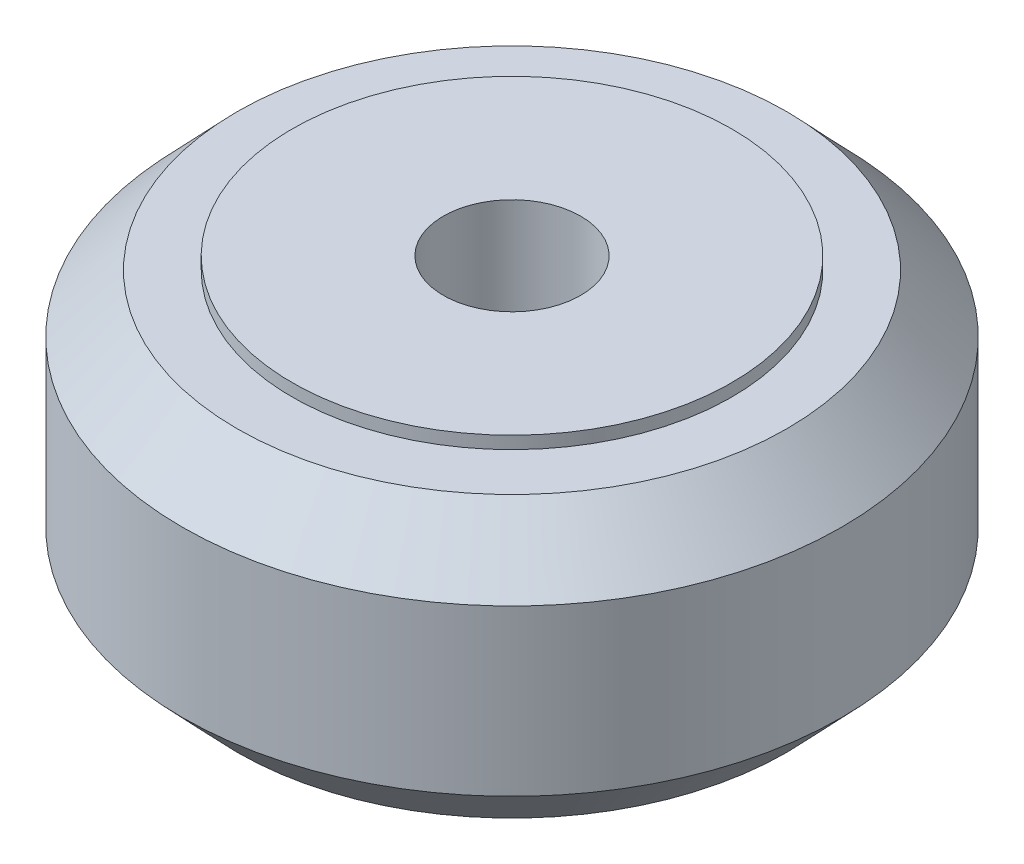
ISO-10303-21;
HEADER;
FILE_DESCRIPTION(('STEP AP214'),'2;1');
FILE_NAME('part.step','',(''),(''),'','','');
FILE_SCHEMA(('AUTOMOTIVE_DESIGN { 1 0 10303 214 1 1 1 1 }'));
ENDSEC;
DATA;
#1=APPLICATION_CONTEXT('core data for automotive mechanical design processes');
#2=APPLICATION_PROTOCOL_DEFINITION('international standard','automotive_design',2000,#1);
#3=PRODUCT_CONTEXT('',#1,'mechanical');
#4=PRODUCT('Part','Part','',(#3));
#5=PRODUCT_RELATED_PRODUCT_CATEGORY('part','',(#4));
#6=PRODUCT_DEFINITION_FORMATION('','',#4);
#7=PRODUCT_DEFINITION_CONTEXT('part definition',#1,'design');
#8=PRODUCT_DEFINITION('design','',#6,#7);
#9=PRODUCT_DEFINITION_SHAPE('','',#8);
#10=(LENGTH_UNIT() NAMED_UNIT(*) SI_UNIT(.MILLI.,.METRE.));
#11=(NAMED_UNIT(*) PLANE_ANGLE_UNIT() SI_UNIT($,.RADIAN.));
#12=(NAMED_UNIT(*) SI_UNIT($,.STERADIAN.) SOLID_ANGLE_UNIT());
#13=UNCERTAINTY_MEASURE_WITH_UNIT(LENGTH_MEASURE(1.E-05),#10,'distance_accuracy_value','');
#14=(GEOMETRIC_REPRESENTATION_CONTEXT(3) GLOBAL_UNCERTAINTY_ASSIGNED_CONTEXT((#13)) GLOBAL_UNIT_ASSIGNED_CONTEXT((#10,
#11,#12)) REPRESENTATION_CONTEXT('',''));
#15=CARTESIAN_POINT('',(0.,0.,0.));
#16=DIRECTION('',(0.,0.,1.));
#17=DIRECTION('',(1.,0.,0.));
#18=AXIS2_PLACEMENT_3D('',#15,#16,#17);
#19=CARTESIAN_POINT('',(2.5,-5.555,0.));
#20=DIRECTION('',(0.,-1.,0.));
#21=DIRECTION('',(0.,0.,-1.));
#22=AXIS2_PLACEMENT_3D('',#19,#20,#21);
#23=PLANE('',#22);
#24=CARTESIAN_POINT('',(0.,-5.555,0.));
#25=DIRECTION('',(0.,-1.,0.));
#26=DIRECTION('',(0.,0.,-1.));
#27=AXIS2_PLACEMENT_3D('',#24,#25,#26);
#28=CIRCLE('',#27,8.);
#29=CARTESIAN_POINT('',(0.,-5.555,-8.));
#30=VERTEX_POINT('',#29);
#31=EDGE_CURVE('E10',#30,#30,#28,.T.);
#32=ORIENTED_EDGE('',*,*,#31,.T.);
#33=EDGE_LOOP('',(#32));
#34=FACE_BOUND('',#33,.T.);
#35=CARTESIAN_POINT('',(0.,-5.555,0.));
#36=DIRECTION('',(0.,-1.,0.));
#37=DIRECTION('',(0.,0.,-1.));
#38=AXIS2_PLACEMENT_3D('',#35,#36,#37);
#39=CIRCLE('',#38,2.5);
#40=CARTESIAN_POINT('',(0.,-5.555,-2.5));
#41=VERTEX_POINT('',#40);
#42=EDGE_CURVE('E80',#41,#41,#39,.T.);
#43=ORIENTED_EDGE('',*,*,#42,.F.);
#44=EDGE_LOOP('',(#43));
#45=FACE_BOUND('',#44,.T.);
#46=ADVANCED_FACE('F36',(#34,#45),#23,.T.);
#47=CARTESIAN_POINT('',(0.,-55.,0.));
#48=DIRECTION('',(0.,-1.,0.));
#49=DIRECTION('',(0.,0.,-1.));
#50=AXIS2_PLACEMENT_3D('',#47,#48,#49);
#51=CYLINDRICAL_SURFACE('',#50,8.);
#52=CARTESIAN_POINT('',(0.,-5.1,0.));
#53=DIRECTION('',(0.,-1.,0.));
#54=DIRECTION('',(0.,0.,-1.));
#55=AXIS2_PLACEMENT_3D('',#52,#53,#54);
#56=CIRCLE('',#55,8.);
#57=CARTESIAN_POINT('',(0.,-5.1,-8.));
#58=VERTEX_POINT('',#57);
#59=EDGE_CURVE('E43',#58,#58,#56,.T.);
#60=ORIENTED_EDGE('',*,*,#59,.T.);
#61=EDGE_LOOP('',(#60));
#62=FACE_BOUND('',#61,.T.);
#63=ORIENTED_EDGE('',*,*,#31,.F.);
#64=EDGE_LOOP('',(#63));
#65=FACE_BOUND('',#64,.T.);
#66=ADVANCED_FACE('F88',(#62,#65),#51,.T.);
#67=CARTESIAN_POINT('',(8.,-5.1,0.));
#68=DIRECTION('',(0.,-1.,0.));
#69=DIRECTION('',(0.,0.,-1.));
#70=AXIS2_PLACEMENT_3D('',#67,#68,#69);
#71=PLANE('',#70);
#72=CARTESIAN_POINT('',(0.,-5.1,0.));
#73=DIRECTION('',(0.,-1.,0.));
#74=DIRECTION('',(0.,0.,-1.));
#75=AXIS2_PLACEMENT_3D('',#72,#73,#74);
#76=CIRCLE('',#75,10.);
#77=CARTESIAN_POINT('',(0.,-5.1,-10.));
#78=VERTEX_POINT('',#77);
#79=EDGE_CURVE('E49',#78,#78,#76,.T.);
#80=ORIENTED_EDGE('',*,*,#79,.T.);
#81=EDGE_LOOP('',(#80));
#82=FACE_BOUND('',#81,.T.);
#83=ORIENTED_EDGE('',*,*,#59,.F.);
#84=EDGE_LOOP('',(#83));
#85=FACE_BOUND('',#84,.T.);
#86=ADVANCED_FACE('F92',(#82,#85),#71,.T.);
#87=CARTESIAN_POINT('',(0.,-5.1,0.));
#88=DIRECTION('',(0.,1.,0.));
#89=DIRECTION('',(0.,0.,1.));
#90=AXIS2_PLACEMENT_3D('',#87,#88,#89);
#91=CONICAL_SURFACE('',#90,10.,0.76101275422473);
#92=CARTESIAN_POINT('',(0.,-3.,0.));
#93=DIRECTION('',(0.,-1.,0.));
#94=DIRECTION('',(0.,0.,-1.));
#95=AXIS2_PLACEMENT_3D('',#92,#93,#94);
#96=CIRCLE('',#95,12.);
#97=CARTESIAN_POINT('',(0.,-3.,-12.));
#98=VERTEX_POINT('',#97);
#99=EDGE_CURVE('E54',#98,#98,#96,.T.);
#100=ORIENTED_EDGE('',*,*,#99,.T.);
#101=EDGE_LOOP('',(#100));
#102=FACE_BOUND('',#101,.T.);
#103=ORIENTED_EDGE('',*,*,#79,.F.);
#104=EDGE_LOOP('',(#103));
#105=FACE_BOUND('',#104,.T.);
#106=ADVANCED_FACE('F96',(#102,#105),#91,.T.);
#107=CARTESIAN_POINT('',(0.,-55.,0.));
#108=DIRECTION('',(0.,-1.,0.));
#109=DIRECTION('',(0.,0.,-1.));
#110=AXIS2_PLACEMENT_3D('',#107,#108,#109);
#111=CYLINDRICAL_SURFACE('',#110,12.);
#112=CARTESIAN_POINT('',(0.,3.,0.));
#113=DIRECTION('',(0.,-1.,0.));
#114=DIRECTION('',(0.,0.,-1.));
#115=AXIS2_PLACEMENT_3D('',#112,#113,#114);
#116=CIRCLE('',#115,12.);
#117=CARTESIAN_POINT('',(0.,3.,-12.));
#118=VERTEX_POINT('',#117);
#119=EDGE_CURVE('E60',#118,#118,#116,.T.);
#120=ORIENTED_EDGE('',*,*,#119,.T.);
#121=EDGE_LOOP('',(#120));
#122=FACE_BOUND('',#121,.T.);
#123=ORIENTED_EDGE('',*,*,#99,.F.);
#124=EDGE_LOOP('',(#123));
#125=FACE_BOUND('',#124,.T.);
#126=ADVANCED_FACE('F103',(#122,#125),#111,.T.);
#127=CARTESIAN_POINT('',(0.,3.,0.));
#128=DIRECTION('',(0.,-1.,0.));
#129=DIRECTION('',(0.,0.,-1.));
#130=AXIS2_PLACEMENT_3D('',#127,#128,#129);
#131=CONICAL_SURFACE('',#130,12.,0.76101275422473);
#132=CARTESIAN_POINT('',(0.,5.1,0.));
#133=DIRECTION('',(0.,-1.,0.));
#134=DIRECTION('',(0.,0.,-1.));
#135=AXIS2_PLACEMENT_3D('',#132,#133,#134);
#136=CIRCLE('',#135,10.);
#137=CARTESIAN_POINT('',(0.,5.1,-10.));
#138=VERTEX_POINT('',#137);
#139=EDGE_CURVE('E64',#138,#138,#136,.T.);
#140=ORIENTED_EDGE('',*,*,#139,.T.);
#141=EDGE_LOOP('',(#140));
#142=FACE_BOUND('',#141,.T.);
#143=ORIENTED_EDGE('',*,*,#119,.F.);
#144=EDGE_LOOP('',(#143));
#145=FACE_BOUND('',#144,.T.);
#146=ADVANCED_FACE('F107',(#142,#145),#131,.T.);
#147=CARTESIAN_POINT('',(8.,5.1,0.));
#148=DIRECTION('',(0.,1.,0.));
#149=DIRECTION('',(0.,0.,1.));
#150=AXIS2_PLACEMENT_3D('',#147,#148,#149);
#151=PLANE('',#150);
#152=CARTESIAN_POINT('',(0.,5.1,0.));
#153=DIRECTION('',(0.,-1.,0.));
#154=DIRECTION('',(0.,0.,-1.));
#155=AXIS2_PLACEMENT_3D('',#152,#153,#154);
#156=CIRCLE('',#155,8.);
#157=CARTESIAN_POINT('',(0.,5.1,-8.));
#158=VERTEX_POINT('',#157);
#159=EDGE_CURVE('E68',#158,#158,#156,.T.);
#160=ORIENTED_EDGE('',*,*,#159,.T.);
#161=EDGE_LOOP('',(#160));
#162=FACE_BOUND('',#161,.T.);
#163=ORIENTED_EDGE('',*,*,#139,.F.);
#164=EDGE_LOOP('',(#163));
#165=FACE_BOUND('',#164,.T.);
#166=ADVANCED_FACE('F111',(#162,#165),#151,.T.);
#167=CARTESIAN_POINT('',(0.,-55.,0.));
#168=DIRECTION('',(0.,-1.,0.));
#169=DIRECTION('',(0.,0.,-1.));
#170=AXIS2_PLACEMENT_3D('',#167,#168,#169);
#171=CYLINDRICAL_SURFACE('',#170,8.);
#172=CARTESIAN_POINT('',(0.,5.555,0.));
#173=DIRECTION('',(0.,-1.,0.));
#174=DIRECTION('',(0.,0.,-1.));
#175=AXIS2_PLACEMENT_3D('',#172,#173,#174);
#176=CIRCLE('',#175,8.);
#177=CARTESIAN_POINT('',(0.,5.555,-8.));
#178=VERTEX_POINT('',#177);
#179=EDGE_CURVE('E72',#178,#178,#176,.T.);
#180=ORIENTED_EDGE('',*,*,#179,.T.);
#181=EDGE_LOOP('',(#180));
#182=FACE_BOUND('',#181,.T.);
#183=ORIENTED_EDGE('',*,*,#159,.F.);
#184=EDGE_LOOP('',(#183));
#185=FACE_BOUND('',#184,.T.);
#186=ADVANCED_FACE('F115',(#182,#185),#171,.T.);
#187=CARTESIAN_POINT('',(2.5,5.555,0.));
#188=DIRECTION('',(0.,1.,0.));
#189=DIRECTION('',(0.,0.,1.));
#190=AXIS2_PLACEMENT_3D('',#187,#188,#189);
#191=PLANE('',#190);
#192=CARTESIAN_POINT('',(0.,5.555,0.));
#193=DIRECTION('',(0.,-1.,0.));
#194=DIRECTION('',(0.,0.,-1.));
#195=AXIS2_PLACEMENT_3D('',#192,#193,#194);
#196=CIRCLE('',#195,2.5);
#197=CARTESIAN_POINT('',(0.,5.555,-2.5));
#198=VERTEX_POINT('',#197);
#199=EDGE_CURVE('E76',#198,#198,#196,.T.);
#200=ORIENTED_EDGE('',*,*,#199,.T.);
#201=EDGE_LOOP('',(#200));
#202=FACE_BOUND('',#201,.T.);
#203=ORIENTED_EDGE('',*,*,#179,.F.);
#204=EDGE_LOOP('',(#203));
#205=FACE_BOUND('',#204,.T.);
#206=ADVANCED_FACE('F119',(#202,#205),#191,.T.);
#207=CARTESIAN_POINT('',(0.,-55.,0.));
#208=DIRECTION('',(0.,-1.,0.));
#209=DIRECTION('',(0.,0.,-1.));
#210=AXIS2_PLACEMENT_3D('',#207,#208,#209);
#211=CYLINDRICAL_SURFACE('',#210,2.5);
#212=ORIENTED_EDGE('',*,*,#42,.T.);
#213=EDGE_LOOP('',(#212));
#214=FACE_BOUND('',#213,.T.);
#215=ORIENTED_EDGE('',*,*,#199,.F.);
#216=EDGE_LOOP('',(#215));
#217=FACE_BOUND('',#216,.T.);
#218=ADVANCED_FACE('F84',(#214,#217),#211,.F.);
#219=CLOSED_SHELL('',(#46,#66,#86,#106,#126,#146,#166,#186,#206,#218));
#220=MANIFOLD_SOLID_BREP('B2',#219);
#221=ADVANCED_BREP_SHAPE_REPRESENTATION('',(#18,#220),#14);
#222=SHAPE_DEFINITION_REPRESENTATION(#9,#221);
ENDSEC;
END-ISO-10303-21;
